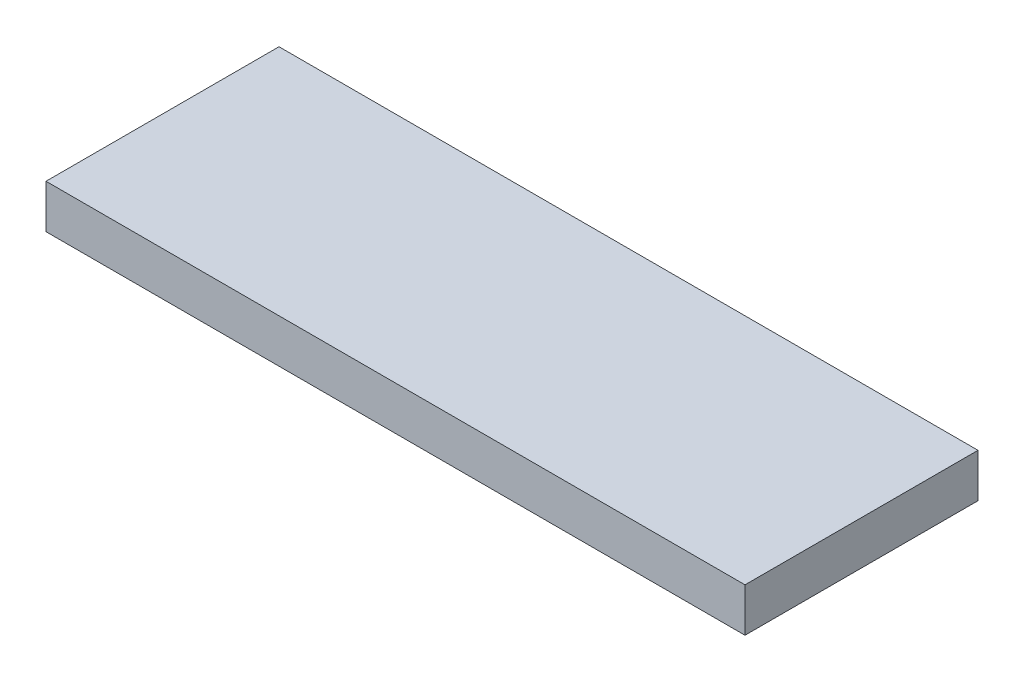
ISO-10303-21;
HEADER;
FILE_DESCRIPTION(('STEP AP214'),'2;1');
FILE_NAME('part.step','',(''),(''),'','','');
FILE_SCHEMA(('AUTOMOTIVE_DESIGN { 1 0 10303 214 1 1 1 1 }'));
ENDSEC;
DATA;
#1=APPLICATION_CONTEXT('core data for automotive mechanical design processes');
#2=APPLICATION_PROTOCOL_DEFINITION('international standard','automotive_design',2000,#1);
#3=PRODUCT_CONTEXT('',#1,'mechanical');
#4=PRODUCT('Part','Part','',(#3));
#5=PRODUCT_RELATED_PRODUCT_CATEGORY('part','',(#4));
#6=PRODUCT_DEFINITION_FORMATION('','',#4);
#7=PRODUCT_DEFINITION_CONTEXT('part definition',#1,'design');
#8=PRODUCT_DEFINITION('design','',#6,#7);
#9=PRODUCT_DEFINITION_SHAPE('','',#8);
#10=(LENGTH_UNIT() NAMED_UNIT(*) SI_UNIT(.MILLI.,.METRE.));
#11=(NAMED_UNIT(*) PLANE_ANGLE_UNIT() SI_UNIT($,.RADIAN.));
#12=(NAMED_UNIT(*) SI_UNIT($,.STERADIAN.) SOLID_ANGLE_UNIT());
#13=UNCERTAINTY_MEASURE_WITH_UNIT(LENGTH_MEASURE(1.E-05),#10,'distance_accuracy_value','');
#14=(GEOMETRIC_REPRESENTATION_CONTEXT(3) GLOBAL_UNCERTAINTY_ASSIGNED_CONTEXT((#13)) GLOBAL_UNIT_ASSIGNED_CONTEXT((#10,
#11,#12)) REPRESENTATION_CONTEXT('',''));
#15=CARTESIAN_POINT('',(0.,0.,0.));
#16=DIRECTION('',(0.,0.,1.));
#17=DIRECTION('',(1.,0.,0.));
#18=AXIS2_PLACEMENT_3D('',#15,#16,#17);
#19=CARTESIAN_POINT('',(48.,6.,-16.));
#20=DIRECTION('',(-1.,0.,0.));
#21=DIRECTION('',(0.,0.,1.));
#22=AXIS2_PLACEMENT_3D('',#19,#20,#21);
#23=PLANE('',#22);
#24=DIRECTION('',(0.,0.,-1.));
#25=VECTOR('',#24,1.);
#26=CARTESIAN_POINT('',(48.,0.,-16.));
#27=LINE('',#26,#25);
#28=CARTESIAN_POINT('',(48.,0.,16.));
#29=VERTEX_POINT('',#28);
#30=CARTESIAN_POINT('',(48.,0.,-16.));
#31=VERTEX_POINT('',#30);
#32=EDGE_CURVE('E96',#29,#31,#27,.T.);
#33=ORIENTED_EDGE('',*,*,#32,.T.);
#34=DIRECTION('',(0.,-1.,0.));
#35=VECTOR('',#34,1.);
#36=CARTESIAN_POINT('',(48.,6.,-16.));
#37=LINE('',#36,#35);
#38=CARTESIAN_POINT('',(48.,6.,-16.));
#39=VERTEX_POINT('',#38);
#40=EDGE_CURVE('E11',#39,#31,#37,.T.);
#41=ORIENTED_EDGE('',*,*,#40,.F.);
#42=DIRECTION('',(0.,0.,-1.));
#43=VECTOR('',#42,1.);
#44=CARTESIAN_POINT('',(48.,6.,-16.));
#45=LINE('',#44,#43);
#46=CARTESIAN_POINT('',(48.,6.,16.));
#47=VERTEX_POINT('',#46);
#48=EDGE_CURVE('E84',#47,#39,#45,.T.);
#49=ORIENTED_EDGE('',*,*,#48,.F.);
#50=DIRECTION('',(0.,-1.,0.));
#51=VECTOR('',#50,1.);
#52=CARTESIAN_POINT('',(48.,6.,16.));
#53=LINE('',#52,#51);
#54=EDGE_CURVE('E92',#47,#29,#53,.T.);
#55=ORIENTED_EDGE('',*,*,#54,.T.);
#56=EDGE_LOOP('',(#33,#41,#49,#55));
#57=FACE_BOUND('',#56,.T.);
#58=ADVANCED_FACE('F33',(#57),#23,.F.);
#59=CARTESIAN_POINT('',(-48.,6.,-16.));
#60=DIRECTION('',(0.,0.,1.));
#61=DIRECTION('',(1.,0.,0.));
#62=AXIS2_PLACEMENT_3D('',#59,#60,#61);
#63=PLANE('',#62);
#64=DIRECTION('',(-1.,0.,0.));
#65=VECTOR('',#64,1.);
#66=CARTESIAN_POINT('',(-48.,0.,-16.));
#67=LINE('',#66,#65);
#68=CARTESIAN_POINT('',(-48.,0.,-16.));
#69=VERTEX_POINT('',#68);
#70=EDGE_CURVE('E88',#31,#69,#67,.T.);
#71=ORIENTED_EDGE('',*,*,#70,.T.);
#72=DIRECTION('',(0.,-1.,0.));
#73=VECTOR('',#72,1.);
#74=CARTESIAN_POINT('',(-48.,6.,-16.));
#75=LINE('',#74,#73);
#76=CARTESIAN_POINT('',(-48.,6.,-16.));
#77=VERTEX_POINT('',#76);
#78=EDGE_CURVE('E41',#77,#69,#75,.T.);
#79=ORIENTED_EDGE('',*,*,#78,.F.);
#80=DIRECTION('',(-1.,0.,0.));
#81=VECTOR('',#80,1.);
#82=CARTESIAN_POINT('',(-48.,6.,-16.));
#83=LINE('',#82,#81);
#84=EDGE_CURVE('E79',#39,#77,#83,.T.);
#85=ORIENTED_EDGE('',*,*,#84,.F.);
#86=ORIENTED_EDGE('',*,*,#40,.T.);
#87=EDGE_LOOP('',(#71,#79,#85,#86));
#88=FACE_BOUND('',#87,.T.);
#89=ADVANCED_FACE('F87',(#88),#63,.F.);
#90=CARTESIAN_POINT('',(-48.,6.,-16.));
#91=DIRECTION('',(1.,0.,0.));
#92=DIRECTION('',(0.,0.,-1.));
#93=AXIS2_PLACEMENT_3D('',#90,#91,#92);
#94=PLANE('',#93);
#95=DIRECTION('',(0.,0.,1.));
#96=VECTOR('',#95,1.);
#97=CARTESIAN_POINT('',(-48.,0.,-16.));
#98=LINE('',#97,#96);
#99=CARTESIAN_POINT('',(-48.,0.,16.));
#100=VERTEX_POINT('',#99);
#101=EDGE_CURVE('E66',#69,#100,#98,.T.);
#102=ORIENTED_EDGE('',*,*,#101,.T.);
#103=DIRECTION('',(0.,-1.,0.));
#104=VECTOR('',#103,1.);
#105=CARTESIAN_POINT('',(-48.,6.,16.));
#106=LINE('',#105,#104);
#107=CARTESIAN_POINT('',(-48.,6.,16.));
#108=VERTEX_POINT('',#107);
#109=EDGE_CURVE('E89',#108,#100,#106,.T.);
#110=ORIENTED_EDGE('',*,*,#109,.F.);
#111=DIRECTION('',(0.,0.,1.));
#112=VECTOR('',#111,1.);
#113=CARTESIAN_POINT('',(-48.,6.,-16.));
#114=LINE('',#113,#112);
#115=EDGE_CURVE('E82',#77,#108,#114,.T.);
#116=ORIENTED_EDGE('',*,*,#115,.F.);
#117=ORIENTED_EDGE('',*,*,#78,.T.);
#118=EDGE_LOOP('',(#102,#110,#116,#117));
#119=FACE_BOUND('',#118,.T.);
#120=ADVANCED_FACE('F90',(#119),#94,.F.);
#121=CARTESIAN_POINT('',(-48.,6.,16.));
#122=DIRECTION('',(0.,0.,-1.));
#123=DIRECTION('',(-1.,0.,0.));
#124=AXIS2_PLACEMENT_3D('',#121,#122,#123);
#125=PLANE('',#124);
#126=DIRECTION('',(1.,0.,0.));
#127=VECTOR('',#126,1.);
#128=CARTESIAN_POINT('',(-48.,0.,16.));
#129=LINE('',#128,#127);
#130=EDGE_CURVE('E72',#100,#29,#129,.T.);
#131=ORIENTED_EDGE('',*,*,#130,.T.);
#132=ORIENTED_EDGE('',*,*,#54,.F.);
#133=DIRECTION('',(1.,0.,0.));
#134=VECTOR('',#133,1.);
#135=CARTESIAN_POINT('',(-48.,6.,16.));
#136=LINE('',#135,#134);
#137=EDGE_CURVE('E49',#108,#47,#136,.T.);
#138=ORIENTED_EDGE('',*,*,#137,.F.);
#139=ORIENTED_EDGE('',*,*,#109,.T.);
#140=EDGE_LOOP('',(#131,#132,#138,#139));
#141=FACE_BOUND('',#140,.T.);
#142=ADVANCED_FACE('F103',(#141),#125,.F.);
#143=CARTESIAN_POINT('',(0.,6.,0.));
#144=DIRECTION('',(0.,1.,0.));
#145=DIRECTION('',(0.,0.,1.));
#146=AXIS2_PLACEMENT_3D('',#143,#144,#145);
#147=PLANE('',#146);
#148=ORIENTED_EDGE('',*,*,#48,.T.);
#149=ORIENTED_EDGE('',*,*,#84,.T.);
#150=ORIENTED_EDGE('',*,*,#115,.T.);
#151=ORIENTED_EDGE('',*,*,#137,.T.);
#152=EDGE_LOOP('',(#148,#149,#150,#151));
#153=FACE_BOUND('',#152,.T.);
#154=ADVANCED_FACE('F80',(#153),#147,.T.);
#155=CARTESIAN_POINT('',(0.,0.,0.));
#156=DIRECTION('',(0.,1.,0.));
#157=DIRECTION('',(0.,0.,1.));
#158=AXIS2_PLACEMENT_3D('',#155,#156,#157);
#159=PLANE('',#158);
#160=ORIENTED_EDGE('',*,*,#32,.F.);
#161=ORIENTED_EDGE('',*,*,#130,.F.);
#162=ORIENTED_EDGE('',*,*,#101,.F.);
#163=ORIENTED_EDGE('',*,*,#70,.F.);
#164=EDGE_LOOP('',(#160,#161,#162,#163));
#165=FACE_BOUND('',#164,.T.);
#166=ADVANCED_FACE('F106',(#165),#159,.F.);
#167=CLOSED_SHELL('',(#58,#89,#120,#142,#154,#166));
#168=MANIFOLD_SOLID_BREP('B2',#167);
#169=ADVANCED_BREP_SHAPE_REPRESENTATION('',(#18,#168),#14);
#170=SHAPE_DEFINITION_REPRESENTATION(#9,#169);
ENDSEC;
END-ISO-10303-21;
